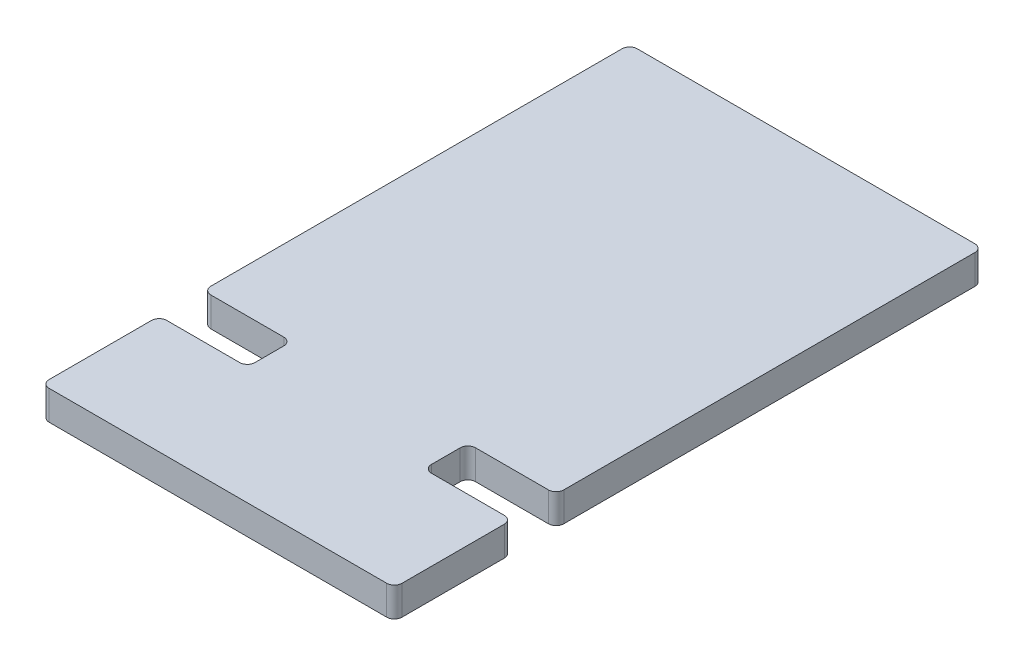
ISO-10303-21;
HEADER;
FILE_DESCRIPTION(('STEP AP214'),'2;1');
FILE_NAME('part.step','',(''),(''),'','','');
FILE_SCHEMA(('AUTOMOTIVE_DESIGN { 1 0 10303 214 1 1 1 1 }'));
ENDSEC;
DATA;
#1=APPLICATION_CONTEXT('core data for automotive mechanical design processes');
#2=APPLICATION_PROTOCOL_DEFINITION('international standard','automotive_design',2000,#1);
#3=PRODUCT_CONTEXT('',#1,'mechanical');
#4=PRODUCT('Part','Part','',(#3));
#5=PRODUCT_RELATED_PRODUCT_CATEGORY('part','',(#4));
#6=PRODUCT_DEFINITION_FORMATION('','',#4);
#7=PRODUCT_DEFINITION_CONTEXT('part definition',#1,'design');
#8=PRODUCT_DEFINITION('design','',#6,#7);
#9=PRODUCT_DEFINITION_SHAPE('','',#8);
#10=(LENGTH_UNIT() NAMED_UNIT(*) SI_UNIT(.MILLI.,.METRE.));
#11=(NAMED_UNIT(*) PLANE_ANGLE_UNIT() SI_UNIT($,.RADIAN.));
#12=(NAMED_UNIT(*) SI_UNIT($,.STERADIAN.) SOLID_ANGLE_UNIT());
#13=UNCERTAINTY_MEASURE_WITH_UNIT(LENGTH_MEASURE(1.E-05),#10,'distance_accuracy_value','');
#14=(GEOMETRIC_REPRESENTATION_CONTEXT(3) GLOBAL_UNCERTAINTY_ASSIGNED_CONTEXT((#13)) GLOBAL_UNIT_ASSIGNED_CONTEXT((#10,
#11,#12)) REPRESENTATION_CONTEXT('',''));
#15=CARTESIAN_POINT('',(0.,0.,0.));
#16=DIRECTION('',(0.,0.,1.));
#17=DIRECTION('',(1.,0.,0.));
#18=AXIS2_PLACEMENT_3D('',#15,#16,#17);
#19=CARTESIAN_POINT('',(-76.2,12.7,127.));
#20=DIRECTION('',(1.,0.,0.));
#21=DIRECTION('',(0.,0.,-1.));
#22=AXIS2_PLACEMENT_3D('',#19,#20,#21);
#23=PLANE('',#22);
#24=DIRECTION('',(0.,0.,1.));
#25=VECTOR('',#24,1.);
#26=CARTESIAN_POINT('',(-76.2,0.,127.));
#27=LINE('',#26,#25);
#28=CARTESIAN_POINT('',(-76.2,0.,-123.698));
#29=VERTEX_POINT('',#28);
#30=CARTESIAN_POINT('',(-76.2,0.,53.848));
#31=VERTEX_POINT('',#30);
#32=EDGE_CURVE('E255',#29,#31,#27,.T.);
#33=ORIENTED_EDGE('',*,*,#32,.T.);
#34=DIRECTION('',(0.,1.,0.));
#35=VECTOR('',#34,1.);
#36=CARTESIAN_POINT('',(-76.2,12.7,53.848));
#37=LINE('',#36,#35);
#38=CARTESIAN_POINT('',(-76.2,12.7,53.848));
#39=VERTEX_POINT('',#38);
#40=EDGE_CURVE('E347',#31,#39,#37,.T.);
#41=ORIENTED_EDGE('',*,*,#40,.T.);
#42=DIRECTION('',(0.,0.,1.));
#43=VECTOR('',#42,1.);
#44=CARTESIAN_POINT('',(-76.2,12.7,127.));
#45=LINE('',#44,#43);
#46=CARTESIAN_POINT('',(-76.2,12.7,-123.698));
#47=VERTEX_POINT('',#46);
#48=EDGE_CURVE('E242',#47,#39,#45,.T.);
#49=ORIENTED_EDGE('',*,*,#48,.F.);
#50=DIRECTION('',(0.,-1.,0.));
#51=VECTOR('',#50,1.);
#52=CARTESIAN_POINT('',(-76.2,12.7,-123.698));
#53=LINE('',#52,#51);
#54=EDGE_CURVE('E344',#47,#29,#53,.T.);
#55=ORIENTED_EDGE('',*,*,#54,.T.);
#56=EDGE_LOOP('',(#33,#41,#49,#55));
#57=FACE_BOUND('',#56,.T.);
#58=ADVANCED_FACE('F34',(#57),#23,.F.);
#59=CARTESIAN_POINT('',(-76.2,0.,79.502));
#60=VERTEX_POINT('',#59);
#61=CARTESIAN_POINT('',(-76.2,0.,123.698));
#62=VERTEX_POINT('',#61);
#63=EDGE_CURVE('E252',#60,#62,#27,.T.);
#64=ORIENTED_EDGE('',*,*,#63,.T.);
#65=DIRECTION('',(0.,-1.,0.));
#66=VECTOR('',#65,1.);
#67=CARTESIAN_POINT('',(-76.2,12.7,123.698));
#68=LINE('',#67,#66);
#69=CARTESIAN_POINT('',(-76.2,12.7,123.698));
#70=VERTEX_POINT('',#69);
#71=EDGE_CURVE('E332',#62,#70,#68,.F.);
#72=ORIENTED_EDGE('',*,*,#71,.T.);
#73=CARTESIAN_POINT('',(-76.2,12.7,79.502));
#74=VERTEX_POINT('',#73);
#75=EDGE_CURVE('E241',#74,#70,#45,.T.);
#76=ORIENTED_EDGE('',*,*,#75,.F.);
#77=DIRECTION('',(0.,1.,0.));
#78=VECTOR('',#77,1.);
#79=CARTESIAN_POINT('',(-76.2,0.,79.502));
#80=LINE('',#79,#78);
#81=EDGE_CURVE('E330',#74,#60,#80,.F.);
#82=ORIENTED_EDGE('',*,*,#81,.T.);
#83=EDGE_LOOP('',(#64,#72,#76,#82));
#84=FACE_BOUND('',#83,.T.);
#85=ADVANCED_FACE('F426',(#84),#23,.F.);
#86=CARTESIAN_POINT('',(0.,12.7,0.));
#87=DIRECTION('',(0.,-1.,0.));
#88=DIRECTION('',(0.,0.,-1.));
#89=AXIS2_PLACEMENT_3D('',#86,#87,#88);
#90=PLANE('',#89);
#91=DIRECTION('',(1.,0.,0.));
#92=VECTOR('',#91,1.);
#93=CARTESIAN_POINT('',(-76.2,12.7,127.));
#94=LINE('',#93,#92);
#95=CARTESIAN_POINT('',(-72.898,12.7,127.));
#96=VERTEX_POINT('',#95);
#97=CARTESIAN_POINT('',(72.8979999999999,12.7,127.));
#98=VERTEX_POINT('',#97);
#99=EDGE_CURVE('E219',#96,#98,#94,.T.);
#100=ORIENTED_EDGE('',*,*,#99,.T.);
#101=CARTESIAN_POINT('',(72.898,12.7,123.698));
#102=DIRECTION('',(0.,-1.,0.));
#103=DIRECTION('',(0.,0.,-1.));
#104=AXIS2_PLACEMENT_3D('',#101,#102,#103);
#105=CIRCLE('',#104,3.302);
#106=CARTESIAN_POINT('',(76.2,12.7,123.698));
#107=VERTEX_POINT('',#106);
#108=EDGE_CURVE('E326',#98,#107,#105,.F.);
#109=ORIENTED_EDGE('',*,*,#108,.T.);
#110=DIRECTION('',(0.,0.,-1.));
#111=VECTOR('',#110,1.);
#112=CARTESIAN_POINT('',(76.2,12.7,127.));
#113=LINE('',#112,#111);
#114=CARTESIAN_POINT('',(76.2,12.7,79.502));
#115=VERTEX_POINT('',#114);
#116=EDGE_CURVE('E237',#107,#115,#113,.T.);
#117=ORIENTED_EDGE('',*,*,#116,.T.);
#118=CARTESIAN_POINT('',(72.898,12.7,79.502));
#119=DIRECTION('',(0.,-1.,0.));
#120=DIRECTION('',(0.,0.,-1.));
#121=AXIS2_PLACEMENT_3D('',#118,#119,#120);
#122=CIRCLE('',#121,3.302);
#123=CARTESIAN_POINT('',(72.898,12.7,76.2));
#124=VERTEX_POINT('',#123);
#125=EDGE_CURVE('E224',#115,#124,#122,.F.);
#126=ORIENTED_EDGE('',*,*,#125,.T.);
#127=DIRECTION('',(1.,0.,0.));
#128=VECTOR('',#127,1.);
#129=CARTESIAN_POINT('',(76.2,12.7,76.2));
#130=LINE('',#129,#128);
#131=CARTESIAN_POINT('',(41.402,12.7,76.2));
#132=VERTEX_POINT('',#131);
#133=EDGE_CURVE('E214',#132,#124,#130,.T.);
#134=ORIENTED_EDGE('',*,*,#133,.F.);
#135=CARTESIAN_POINT('',(41.402,12.7,72.898));
#136=DIRECTION('',(0.,-1.,0.));
#137=DIRECTION('',(0.,0.,-1.));
#138=AXIS2_PLACEMENT_3D('',#135,#136,#137);
#139=CIRCLE('',#138,3.302);
#140=CARTESIAN_POINT('',(38.1,12.7,72.898));
#141=VERTEX_POINT('',#140);
#142=EDGE_CURVE('E198',#132,#141,#139,.T.);
#143=ORIENTED_EDGE('',*,*,#142,.T.);
#144=DIRECTION('',(0.,0.,1.));
#145=VECTOR('',#144,1.);
#146=CARTESIAN_POINT('',(38.1,12.7,57.15));
#147=LINE('',#146,#145);
#148=CARTESIAN_POINT('',(38.1,12.7,60.452));
#149=VERTEX_POINT('',#148);
#150=EDGE_CURVE('E226',#149,#141,#147,.T.);
#151=ORIENTED_EDGE('',*,*,#150,.F.);
#152=CARTESIAN_POINT('',(41.402,12.7,60.452));
#153=DIRECTION('',(0.,-1.,0.));
#154=DIRECTION('',(0.,0.,-1.));
#155=AXIS2_PLACEMENT_3D('',#152,#153,#154);
#156=CIRCLE('',#155,3.302);
#157=CARTESIAN_POINT('',(41.402,12.7,57.15));
#158=VERTEX_POINT('',#157);
#159=EDGE_CURVE('E264',#149,#158,#156,.T.);
#160=ORIENTED_EDGE('',*,*,#159,.T.);
#161=DIRECTION('',(-1.,0.,0.));
#162=VECTOR('',#161,1.);
#163=CARTESIAN_POINT('',(76.2,12.7,57.15));
#164=LINE('',#163,#162);
#165=CARTESIAN_POINT('',(72.898,12.7,57.15));
#166=VERTEX_POINT('',#165);
#167=EDGE_CURVE('E230',#166,#158,#164,.T.);
#168=ORIENTED_EDGE('',*,*,#167,.F.);
#169=CARTESIAN_POINT('',(72.898,12.7,53.848));
#170=DIRECTION('',(0.,-1.,0.));
#171=DIRECTION('',(0.,0.,-1.));
#172=AXIS2_PLACEMENT_3D('',#169,#170,#171);
#173=CIRCLE('',#172,3.302);
#174=CARTESIAN_POINT('',(76.2,12.7,53.848));
#175=VERTEX_POINT('',#174);
#176=EDGE_CURVE('E319',#166,#175,#173,.F.);
#177=ORIENTED_EDGE('',*,*,#176,.T.);
#178=CARTESIAN_POINT('',(76.2,12.7,-123.698));
#179=VERTEX_POINT('',#178);
#180=EDGE_CURVE('E234',#175,#179,#113,.T.);
#181=ORIENTED_EDGE('',*,*,#180,.T.);
#182=CARTESIAN_POINT('',(72.898,12.7,-123.698));
#183=DIRECTION('',(0.,-1.,0.));
#184=DIRECTION('',(0.,0.,-1.));
#185=AXIS2_PLACEMENT_3D('',#182,#183,#184);
#186=CIRCLE('',#185,3.302);
#187=CARTESIAN_POINT('',(72.8979999999999,12.7,-127.));
#188=VERTEX_POINT('',#187);
#189=EDGE_CURVE('E316',#179,#188,#186,.F.);
#190=ORIENTED_EDGE('',*,*,#189,.T.);
#191=DIRECTION('',(-1.,0.,0.));
#192=VECTOR('',#191,1.);
#193=CARTESIAN_POINT('',(-76.2,12.7,-127.));
#194=LINE('',#193,#192);
#195=CARTESIAN_POINT('',(-72.898,12.7,-127.));
#196=VERTEX_POINT('',#195);
#197=EDGE_CURVE('E239',#188,#196,#194,.T.);
#198=ORIENTED_EDGE('',*,*,#197,.T.);
#199=CARTESIAN_POINT('',(-72.898,12.7,-123.698));
#200=DIRECTION('',(0.,-1.,0.));
#201=DIRECTION('',(0.,0.,-1.));
#202=AXIS2_PLACEMENT_3D('',#199,#200,#201);
#203=CIRCLE('',#202,3.302);
#204=EDGE_CURVE('E57',#196,#47,#203,.F.);
#205=ORIENTED_EDGE('',*,*,#204,.T.);
#206=ORIENTED_EDGE('',*,*,#48,.T.);
#207=CARTESIAN_POINT('',(-72.898,12.7,53.848));
#208=DIRECTION('',(0.,-1.,0.));
#209=DIRECTION('',(0.,0.,-1.));
#210=AXIS2_PLACEMENT_3D('',#207,#208,#209);
#211=CIRCLE('',#210,3.302);
#212=CARTESIAN_POINT('',(-72.898,12.7,57.15));
#213=VERTEX_POINT('',#212);
#214=EDGE_CURVE('E49',#39,#213,#211,.F.);
#215=ORIENTED_EDGE('',*,*,#214,.T.);
#216=DIRECTION('',(1.,0.,0.));
#217=VECTOR('',#216,1.);
#218=CARTESIAN_POINT('',(-76.2,12.7,57.15));
#219=LINE('',#218,#217);
#220=CARTESIAN_POINT('',(-41.402,12.7,57.15));
#221=VERTEX_POINT('',#220);
#222=EDGE_CURVE('E370',#213,#221,#219,.T.);
#223=ORIENTED_EDGE('',*,*,#222,.T.);
#224=CARTESIAN_POINT('',(-41.402,12.7,60.452));
#225=DIRECTION('',(0.,-1.,0.));
#226=DIRECTION('',(0.,0.,-1.));
#227=AXIS2_PLACEMENT_3D('',#224,#225,#226);
#228=CIRCLE('',#227,3.302);
#229=CARTESIAN_POINT('',(-38.1,12.7,60.452));
#230=VERTEX_POINT('',#229);
#231=EDGE_CURVE('E283',#221,#230,#228,.T.);
#232=ORIENTED_EDGE('',*,*,#231,.T.);
#233=DIRECTION('',(0.,0.,1.));
#234=VECTOR('',#233,1.);
#235=CARTESIAN_POINT('',(-38.1,12.7,57.15));
#236=LINE('',#235,#234);
#237=CARTESIAN_POINT('',(-38.1,12.7,72.898));
#238=VERTEX_POINT('',#237);
#239=EDGE_CURVE('E376',#230,#238,#236,.T.);
#240=ORIENTED_EDGE('',*,*,#239,.T.);
#241=CARTESIAN_POINT('',(-41.402,12.7,72.898));
#242=DIRECTION('',(0.,-1.,0.));
#243=DIRECTION('',(0.,0.,-1.));
#244=AXIS2_PLACEMENT_3D('',#241,#242,#243);
#245=CIRCLE('',#244,3.302);
#246=CARTESIAN_POINT('',(-41.402,12.7,76.2));
#247=VERTEX_POINT('',#246);
#248=EDGE_CURVE('E279',#238,#247,#245,.T.);
#249=ORIENTED_EDGE('',*,*,#248,.T.);
#250=DIRECTION('',(-1.,0.,0.));
#251=VECTOR('',#250,1.);
#252=CARTESIAN_POINT('',(-76.2,12.7,76.2));
#253=LINE('',#252,#251);
#254=CARTESIAN_POINT('',(-72.898,12.7,76.2));
#255=VERTEX_POINT('',#254);
#256=EDGE_CURVE('E382',#247,#255,#253,.T.);
#257=ORIENTED_EDGE('',*,*,#256,.T.);
#258=CARTESIAN_POINT('',(-72.898,12.7,79.502));
#259=DIRECTION('',(0.,-1.,0.));
#260=DIRECTION('',(0.,0.,-1.));
#261=AXIS2_PLACEMENT_3D('',#258,#259,#260);
#262=CIRCLE('',#261,3.302);
#263=EDGE_CURVE('E321',#255,#74,#262,.F.);
#264=ORIENTED_EDGE('',*,*,#263,.T.);
#265=ORIENTED_EDGE('',*,*,#75,.T.);
#266=CARTESIAN_POINT('',(-72.898,12.7,123.698));
#267=DIRECTION('',(0.,-1.,0.));
#268=DIRECTION('',(0.,0.,-1.));
#269=AXIS2_PLACEMENT_3D('',#266,#267,#268);
#270=CIRCLE('',#269,3.302);
#271=EDGE_CURVE('E323',#70,#96,#270,.F.);
#272=ORIENTED_EDGE('',*,*,#271,.T.);
#273=EDGE_LOOP('',(#100,#109,#117,#126,#134,#143,#151,#160,#168,#177,#181,#190,#198,#205,#206,
#215,#223,#232,#240,#249,#257,#264,#265,#272));
#274=FACE_BOUND('',#273,.T.);
#275=ADVANCED_FACE('F222',(#274),#90,.F.);
#276=CARTESIAN_POINT('',(0.,0.,0.));
#277=DIRECTION('',(0.,-1.,0.));
#278=DIRECTION('',(0.,0.,-1.));
#279=AXIS2_PLACEMENT_3D('',#276,#277,#278);
#280=PLANE('',#279);
#281=DIRECTION('',(0.,0.,-1.));
#282=VECTOR('',#281,1.);
#283=CARTESIAN_POINT('',(76.2,0.,127.));
#284=LINE('',#283,#282);
#285=CARTESIAN_POINT('',(76.2,0.,123.698));
#286=VERTEX_POINT('',#285);
#287=CARTESIAN_POINT('',(76.2,0.,79.502));
#288=VERTEX_POINT('',#287);
#289=EDGE_CURVE('E248',#286,#288,#284,.T.);
#290=ORIENTED_EDGE('',*,*,#289,.F.);
#291=CARTESIAN_POINT('',(72.898,0.,123.698));
#292=DIRECTION('',(0.,-1.,0.));
#293=DIRECTION('',(0.,0.,-1.));
#294=AXIS2_PLACEMENT_3D('',#291,#292,#293);
#295=CIRCLE('',#294,3.302);
#296=CARTESIAN_POINT('',(72.8979999999999,0.,127.));
#297=VERTEX_POINT('',#296);
#298=EDGE_CURVE('E308',#286,#297,#295,.T.);
#299=ORIENTED_EDGE('',*,*,#298,.T.);
#300=DIRECTION('',(1.,0.,0.));
#301=VECTOR('',#300,1.);
#302=CARTESIAN_POINT('',(-76.2,0.,127.));
#303=LINE('',#302,#301);
#304=CARTESIAN_POINT('',(-72.898,0.,127.));
#305=VERTEX_POINT('',#304);
#306=EDGE_CURVE('E238',#305,#297,#303,.T.);
#307=ORIENTED_EDGE('',*,*,#306,.F.);
#308=CARTESIAN_POINT('',(-72.898,0.,123.698));
#309=DIRECTION('',(0.,-1.,0.));
#310=DIRECTION('',(0.,0.,-1.));
#311=AXIS2_PLACEMENT_3D('',#308,#309,#310);
#312=CIRCLE('',#311,3.302);
#313=EDGE_CURVE('E304',#305,#62,#312,.T.);
#314=ORIENTED_EDGE('',*,*,#313,.T.);
#315=ORIENTED_EDGE('',*,*,#63,.F.);
#316=CARTESIAN_POINT('',(-72.898,0.,79.502));
#317=DIRECTION('',(0.,-1.,0.));
#318=DIRECTION('',(0.,0.,-1.));
#319=AXIS2_PLACEMENT_3D('',#316,#317,#318);
#320=CIRCLE('',#319,3.302);
#321=CARTESIAN_POINT('',(-72.898,0.,76.2));
#322=VERTEX_POINT('',#321);
#323=EDGE_CURVE('E302',#60,#322,#320,.T.);
#324=ORIENTED_EDGE('',*,*,#323,.T.);
#325=DIRECTION('',(-1.,0.,0.));
#326=VECTOR('',#325,1.);
#327=CARTESIAN_POINT('',(-76.2,0.,76.2));
#328=LINE('',#327,#326);
#329=CARTESIAN_POINT('',(-41.402,0.,76.2));
#330=VERTEX_POINT('',#329);
#331=EDGE_CURVE('E375',#330,#322,#328,.T.);
#332=ORIENTED_EDGE('',*,*,#331,.F.);
#333=CARTESIAN_POINT('',(-41.402,0.,72.898));
#334=DIRECTION('',(0.,-1.,0.));
#335=DIRECTION('',(0.,0.,-1.));
#336=AXIS2_PLACEMENT_3D('',#333,#334,#335);
#337=CIRCLE('',#336,3.302);
#338=CARTESIAN_POINT('',(-38.1,0.,72.898));
#339=VERTEX_POINT('',#338);
#340=EDGE_CURVE('E281',#330,#339,#337,.F.);
#341=ORIENTED_EDGE('',*,*,#340,.T.);
#342=DIRECTION('',(0.,0.,1.));
#343=VECTOR('',#342,1.);
#344=CARTESIAN_POINT('',(-38.1,0.,57.15));
#345=LINE('',#344,#343);
#346=CARTESIAN_POINT('',(-38.1,0.,60.452));
#347=VERTEX_POINT('',#346);
#348=EDGE_CURVE('E379',#347,#339,#345,.T.);
#349=ORIENTED_EDGE('',*,*,#348,.F.);
#350=CARTESIAN_POINT('',(-41.402,0.,60.452));
#351=DIRECTION('',(0.,-1.,0.));
#352=DIRECTION('',(0.,0.,-1.));
#353=AXIS2_PLACEMENT_3D('',#350,#351,#352);
#354=CIRCLE('',#353,3.302);
#355=CARTESIAN_POINT('',(-41.402,0.,57.15));
#356=VERTEX_POINT('',#355);
#357=EDGE_CURVE('E285',#347,#356,#354,.F.);
#358=ORIENTED_EDGE('',*,*,#357,.T.);
#359=DIRECTION('',(1.,0.,0.));
#360=VECTOR('',#359,1.);
#361=CARTESIAN_POINT('',(-76.2,0.,57.15));
#362=LINE('',#361,#360);
#363=CARTESIAN_POINT('',(-72.898,0.,57.15));
#364=VERTEX_POINT('',#363);
#365=EDGE_CURVE('E367',#364,#356,#362,.T.);
#366=ORIENTED_EDGE('',*,*,#365,.F.);
#367=CARTESIAN_POINT('',(-72.898,0.,53.848));
#368=DIRECTION('',(0.,-1.,0.));
#369=DIRECTION('',(0.,0.,-1.));
#370=AXIS2_PLACEMENT_3D('',#367,#368,#369);
#371=CIRCLE('',#370,3.302);
#372=EDGE_CURVE('E298',#364,#31,#371,.T.);
#373=ORIENTED_EDGE('',*,*,#372,.T.);
#374=ORIENTED_EDGE('',*,*,#32,.F.);
#375=CARTESIAN_POINT('',(-72.898,0.,-123.698));
#376=DIRECTION('',(0.,-1.,0.));
#377=DIRECTION('',(0.,0.,-1.));
#378=AXIS2_PLACEMENT_3D('',#375,#376,#377);
#379=CIRCLE('',#378,3.302);
#380=CARTESIAN_POINT('',(-72.898,0.,-127.));
#381=VERTEX_POINT('',#380);
#382=EDGE_CURVE('E294',#29,#381,#379,.T.);
#383=ORIENTED_EDGE('',*,*,#382,.T.);
#384=DIRECTION('',(-1.,0.,0.));
#385=VECTOR('',#384,1.);
#386=CARTESIAN_POINT('',(-76.2,0.,-127.));
#387=LINE('',#386,#385);
#388=CARTESIAN_POINT('',(72.8979999999999,0.,-127.));
#389=VERTEX_POINT('',#388);
#390=EDGE_CURVE('E249',#389,#381,#387,.T.);
#391=ORIENTED_EDGE('',*,*,#390,.F.);
#392=CARTESIAN_POINT('',(72.898,0.,-123.698));
#393=DIRECTION('',(0.,-1.,0.));
#394=DIRECTION('',(0.,0.,-1.));
#395=AXIS2_PLACEMENT_3D('',#392,#393,#394);
#396=CIRCLE('',#395,3.302);
#397=CARTESIAN_POINT('',(76.2,0.,-123.698));
#398=VERTEX_POINT('',#397);
#399=EDGE_CURVE('E296',#389,#398,#396,.T.);
#400=ORIENTED_EDGE('',*,*,#399,.T.);
#401=CARTESIAN_POINT('',(76.2,0.,53.848));
#402=VERTEX_POINT('',#401);
#403=EDGE_CURVE('E245',#402,#398,#284,.T.);
#404=ORIENTED_EDGE('',*,*,#403,.F.);
#405=CARTESIAN_POINT('',(72.898,0.,53.848));
#406=DIRECTION('',(0.,-1.,0.));
#407=DIRECTION('',(0.,0.,-1.));
#408=AXIS2_PLACEMENT_3D('',#405,#406,#407);
#409=CIRCLE('',#408,3.302);
#410=CARTESIAN_POINT('',(72.898,0.,57.15));
#411=VERTEX_POINT('',#410);
#412=EDGE_CURVE('E300',#402,#411,#409,.T.);
#413=ORIENTED_EDGE('',*,*,#412,.T.);
#414=DIRECTION('',(-1.,0.,0.));
#415=VECTOR('',#414,1.);
#416=CARTESIAN_POINT('',(76.2,0.,57.15));
#417=LINE('',#416,#415);
#418=CARTESIAN_POINT('',(41.402,0.,57.15));
#419=VERTEX_POINT('',#418);
#420=EDGE_CURVE('E225',#411,#419,#417,.T.);
#421=ORIENTED_EDGE('',*,*,#420,.T.);
#422=CARTESIAN_POINT('',(41.402,0.,60.452));
#423=DIRECTION('',(0.,-1.,0.));
#424=DIRECTION('',(0.,0.,-1.));
#425=AXIS2_PLACEMENT_3D('',#422,#423,#424);
#426=CIRCLE('',#425,3.302);
#427=CARTESIAN_POINT('',(38.1,0.,60.452));
#428=VERTEX_POINT('',#427);
#429=EDGE_CURVE('E267',#419,#428,#426,.F.);
#430=ORIENTED_EDGE('',*,*,#429,.T.);
#431=DIRECTION('',(0.,0.,1.));
#432=VECTOR('',#431,1.);
#433=CARTESIAN_POINT('',(38.1,0.,57.15));
#434=LINE('',#433,#432);
#435=CARTESIAN_POINT('',(38.1,0.,72.898));
#436=VERTEX_POINT('',#435);
#437=EDGE_CURVE('E228',#428,#436,#434,.T.);
#438=ORIENTED_EDGE('',*,*,#437,.T.);
#439=CARTESIAN_POINT('',(41.402,0.,72.898));
#440=DIRECTION('',(0.,-1.,0.));
#441=DIRECTION('',(0.,0.,-1.));
#442=AXIS2_PLACEMENT_3D('',#439,#440,#441);
#443=CIRCLE('',#442,3.302);
#444=CARTESIAN_POINT('',(41.402,0.,76.2));
#445=VERTEX_POINT('',#444);
#446=EDGE_CURVE('E207',#436,#445,#443,.F.);
#447=ORIENTED_EDGE('',*,*,#446,.T.);
#448=DIRECTION('',(1.,0.,0.));
#449=VECTOR('',#448,1.);
#450=CARTESIAN_POINT('',(76.2,0.,76.2));
#451=LINE('',#450,#449);
#452=CARTESIAN_POINT('',(72.898,0.,76.2));
#453=VERTEX_POINT('',#452);
#454=EDGE_CURVE('E217',#445,#453,#451,.T.);
#455=ORIENTED_EDGE('',*,*,#454,.T.);
#456=CARTESIAN_POINT('',(72.898,0.,79.502));
#457=DIRECTION('',(0.,-1.,0.));
#458=DIRECTION('',(0.,0.,-1.));
#459=AXIS2_PLACEMENT_3D('',#456,#457,#458);
#460=CIRCLE('',#459,3.302);
#461=EDGE_CURVE('E306',#453,#288,#460,.T.);
#462=ORIENTED_EDGE('',*,*,#461,.T.);
#463=EDGE_LOOP('',(#290,#299,#307,#314,#315,#324,#332,#341,#349,#358,#366,#373,#374,#383,#391,
#400,#404,#413,#421,#430,#438,#447,#455,#462));
#464=FACE_BOUND('',#463,.T.);
#465=ADVANCED_FACE('F364',(#464),#280,.T.);
#466=CARTESIAN_POINT('',(76.2,12.7,127.));
#467=DIRECTION('',(-1.,0.,0.));
#468=DIRECTION('',(0.,0.,1.));
#469=AXIS2_PLACEMENT_3D('',#466,#467,#468);
#470=PLANE('',#469);
#471=ORIENTED_EDGE('',*,*,#116,.F.);
#472=DIRECTION('',(0.,-1.,0.));
#473=VECTOR('',#472,1.);
#474=CARTESIAN_POINT('',(76.2,12.7,123.698));
#475=LINE('',#474,#473);
#476=EDGE_CURVE('E291',#107,#286,#475,.T.);
#477=ORIENTED_EDGE('',*,*,#476,.T.);
#478=ORIENTED_EDGE('',*,*,#289,.T.);
#479=DIRECTION('',(0.,1.,0.));
#480=VECTOR('',#479,1.);
#481=CARTESIAN_POINT('',(76.2,12.7,79.502));
#482=LINE('',#481,#480);
#483=EDGE_CURVE('E288',#288,#115,#482,.T.);
#484=ORIENTED_EDGE('',*,*,#483,.T.);
#485=EDGE_LOOP('',(#471,#477,#478,#484));
#486=FACE_BOUND('',#485,.T.);
#487=ADVANCED_FACE('F441',(#486),#470,.F.);
#488=ORIENTED_EDGE('',*,*,#180,.F.);
#489=DIRECTION('',(0.,1.,0.));
#490=VECTOR('',#489,1.);
#491=CARTESIAN_POINT('',(76.2,12.7,53.848));
#492=LINE('',#491,#490);
#493=EDGE_CURVE('E342',#175,#402,#492,.F.);
#494=ORIENTED_EDGE('',*,*,#493,.T.);
#495=ORIENTED_EDGE('',*,*,#403,.T.);
#496=DIRECTION('',(0.,-1.,0.));
#497=VECTOR('',#496,1.);
#498=CARTESIAN_POINT('',(76.2,12.7,-123.698));
#499=LINE('',#498,#497);
#500=EDGE_CURVE('E340',#398,#179,#499,.F.);
#501=ORIENTED_EDGE('',*,*,#500,.T.);
#502=EDGE_LOOP('',(#488,#494,#495,#501));
#503=FACE_BOUND('',#502,.T.);
#504=ADVANCED_FACE('F438',(#503),#470,.F.);
#505=CARTESIAN_POINT('',(-76.2,12.7,-127.));
#506=DIRECTION('',(0.,0.,1.));
#507=DIRECTION('',(1.,0.,0.));
#508=AXIS2_PLACEMENT_3D('',#505,#506,#507);
#509=PLANE('',#508);
#510=ORIENTED_EDGE('',*,*,#197,.F.);
#511=DIRECTION('',(0.,-1.,0.));
#512=VECTOR('',#511,1.);
#513=CARTESIAN_POINT('',(72.898,12.7,-127.));
#514=LINE('',#513,#512);
#515=EDGE_CURVE('E11',#188,#389,#514,.T.);
#516=ORIENTED_EDGE('',*,*,#515,.T.);
#517=ORIENTED_EDGE('',*,*,#390,.T.);
#518=DIRECTION('',(0.,-1.,0.));
#519=VECTOR('',#518,1.);
#520=CARTESIAN_POINT('',(-72.898,12.7,-127.));
#521=LINE('',#520,#519);
#522=EDGE_CURVE('E42',#381,#196,#521,.F.);
#523=ORIENTED_EDGE('',*,*,#522,.T.);
#524=EDGE_LOOP('',(#510,#516,#517,#523));
#525=FACE_BOUND('',#524,.T.);
#526=ADVANCED_FACE('F353',(#525),#509,.F.);
#527=CARTESIAN_POINT('',(-76.2,12.7,127.));
#528=DIRECTION('',(0.,0.,-1.));
#529=DIRECTION('',(-1.,0.,0.));
#530=AXIS2_PLACEMENT_3D('',#527,#528,#529);
#531=PLANE('',#530);
#532=ORIENTED_EDGE('',*,*,#306,.T.);
#533=DIRECTION('',(0.,-1.,0.));
#534=VECTOR('',#533,1.);
#535=CARTESIAN_POINT('',(72.898,12.7,127.));
#536=LINE('',#535,#534);
#537=EDGE_CURVE('E313',#297,#98,#536,.F.);
#538=ORIENTED_EDGE('',*,*,#537,.T.);
#539=ORIENTED_EDGE('',*,*,#99,.F.);
#540=DIRECTION('',(0.,-1.,0.));
#541=VECTOR('',#540,1.);
#542=CARTESIAN_POINT('',(-72.898,12.7,127.));
#543=LINE('',#542,#541);
#544=EDGE_CURVE('E310',#96,#305,#543,.T.);
#545=ORIENTED_EDGE('',*,*,#544,.T.);
#546=EDGE_LOOP('',(#532,#538,#539,#545));
#547=FACE_BOUND('',#546,.T.);
#548=ADVANCED_FACE('F434',(#547),#531,.F.);
#549=CARTESIAN_POINT('',(76.2,0.,76.2));
#550=DIRECTION('',(0.,0.,1.));
#551=DIRECTION('',(1.,0.,0.));
#552=AXIS2_PLACEMENT_3D('',#549,#550,#551);
#553=PLANE('',#552);
#554=ORIENTED_EDGE('',*,*,#133,.T.);
#555=DIRECTION('',(0.,1.,0.));
#556=VECTOR('',#555,1.);
#557=CARTESIAN_POINT('',(72.898,0.,76.2));
#558=LINE('',#557,#556);
#559=EDGE_CURVE('E328',#124,#453,#558,.F.);
#560=ORIENTED_EDGE('',*,*,#559,.T.);
#561=ORIENTED_EDGE('',*,*,#454,.F.);
#562=DIRECTION('',(0.,1.,0.));
#563=VECTOR('',#562,1.);
#564=CARTESIAN_POINT('',(41.402,12.7,76.2));
#565=LINE('',#564,#563);
#566=EDGE_CURVE('E202',#445,#132,#565,.T.);
#567=ORIENTED_EDGE('',*,*,#566,.T.);
#568=EDGE_LOOP('',(#554,#560,#561,#567));
#569=FACE_BOUND('',#568,.T.);
#570=ADVANCED_FACE('F213',(#569),#553,.F.);
#571=CARTESIAN_POINT('',(38.1,0.,57.15));
#572=DIRECTION('',(-1.,0.,0.));
#573=DIRECTION('',(0.,0.,1.));
#574=AXIS2_PLACEMENT_3D('',#571,#572,#573);
#575=PLANE('',#574);
#576=ORIENTED_EDGE('',*,*,#150,.T.);
#577=DIRECTION('',(0.,1.,0.));
#578=VECTOR('',#577,1.);
#579=CARTESIAN_POINT('',(38.1,0.,72.898));
#580=LINE('',#579,#578);
#581=EDGE_CURVE('E203',#141,#436,#580,.F.);
#582=ORIENTED_EDGE('',*,*,#581,.T.);
#583=ORIENTED_EDGE('',*,*,#437,.F.);
#584=DIRECTION('',(0.,1.,0.));
#585=VECTOR('',#584,1.);
#586=CARTESIAN_POINT('',(38.1,12.7,60.452));
#587=LINE('',#586,#585);
#588=EDGE_CURVE('E218',#428,#149,#587,.T.);
#589=ORIENTED_EDGE('',*,*,#588,.T.);
#590=EDGE_LOOP('',(#576,#582,#583,#589));
#591=FACE_BOUND('',#590,.T.);
#592=ADVANCED_FACE('F459',(#591),#575,.F.);
#593=CARTESIAN_POINT('',(76.2,0.,57.15));
#594=DIRECTION('',(0.,0.,-1.));
#595=DIRECTION('',(-1.,0.,0.));
#596=AXIS2_PLACEMENT_3D('',#593,#594,#595);
#597=PLANE('',#596);
#598=ORIENTED_EDGE('',*,*,#420,.F.);
#599=DIRECTION('',(0.,1.,0.));
#600=VECTOR('',#599,1.);
#601=CARTESIAN_POINT('',(72.898,0.,57.15));
#602=LINE('',#601,#600);
#603=EDGE_CURVE('E337',#411,#166,#602,.T.);
#604=ORIENTED_EDGE('',*,*,#603,.T.);
#605=ORIENTED_EDGE('',*,*,#167,.T.);
#606=DIRECTION('',(0.,1.,0.));
#607=VECTOR('',#606,1.);
#608=CARTESIAN_POINT('',(41.402,0.,57.15));
#609=LINE('',#608,#607);
#610=EDGE_CURVE('E208',#158,#419,#609,.F.);
#611=ORIENTED_EDGE('',*,*,#610,.T.);
#612=EDGE_LOOP('',(#598,#604,#605,#611));
#613=FACE_BOUND('',#612,.T.);
#614=ADVANCED_FACE('F446',(#613),#597,.F.);
#615=CARTESIAN_POINT('',(41.402,0.,72.898));
#616=DIRECTION('',(0.,-1.,0.));
#617=DIRECTION('',(0.,0.,-1.));
#618=AXIS2_PLACEMENT_3D('',#615,#616,#617);
#619=CYLINDRICAL_SURFACE('',#618,3.302);
#620=ORIENTED_EDGE('',*,*,#446,.F.);
#621=ORIENTED_EDGE('',*,*,#581,.F.);
#622=ORIENTED_EDGE('',*,*,#142,.F.);
#623=ORIENTED_EDGE('',*,*,#566,.F.);
#624=EDGE_LOOP('',(#620,#621,#622,#623));
#625=FACE_BOUND('',#624,.T.);
#626=ADVANCED_FACE('F201',(#625),#619,.F.);
#627=CARTESIAN_POINT('',(41.402,0.,60.452));
#628=DIRECTION('',(0.,-1.,0.));
#629=DIRECTION('',(0.,0.,-1.));
#630=AXIS2_PLACEMENT_3D('',#627,#628,#629);
#631=CYLINDRICAL_SURFACE('',#630,3.302);
#632=ORIENTED_EDGE('',*,*,#429,.F.);
#633=ORIENTED_EDGE('',*,*,#610,.F.);
#634=ORIENTED_EDGE('',*,*,#159,.F.);
#635=ORIENTED_EDGE('',*,*,#588,.F.);
#636=EDGE_LOOP('',(#632,#633,#634,#635));
#637=FACE_BOUND('',#636,.T.);
#638=ADVANCED_FACE('F445',(#637),#631,.F.);
#639=CARTESIAN_POINT('',(-76.2,0.,57.15));
#640=DIRECTION('',(0.,0.,1.));
#641=DIRECTION('',(1.,0.,0.));
#642=AXIS2_PLACEMENT_3D('',#639,#640,#641);
#643=PLANE('',#642);
#644=ORIENTED_EDGE('',*,*,#222,.F.);
#645=DIRECTION('',(0.,1.,0.));
#646=VECTOR('',#645,1.);
#647=CARTESIAN_POINT('',(-72.898,0.,57.15));
#648=LINE('',#647,#646);
#649=EDGE_CURVE('E349',#213,#364,#648,.F.);
#650=ORIENTED_EDGE('',*,*,#649,.T.);
#651=ORIENTED_EDGE('',*,*,#365,.T.);
#652=DIRECTION('',(0.,1.,0.));
#653=VECTOR('',#652,1.);
#654=CARTESIAN_POINT('',(-41.402,12.7,57.15));
#655=LINE('',#654,#653);
#656=EDGE_CURVE('E276',#356,#221,#655,.T.);
#657=ORIENTED_EDGE('',*,*,#656,.T.);
#658=EDGE_LOOP('',(#644,#650,#651,#657));
#659=FACE_BOUND('',#658,.T.);
#660=ADVANCED_FACE('F373',(#659),#643,.T.);
#661=CARTESIAN_POINT('',(-38.1,0.,57.15));
#662=DIRECTION('',(-1.,0.,0.));
#663=DIRECTION('',(0.,0.,1.));
#664=AXIS2_PLACEMENT_3D('',#661,#662,#663);
#665=PLANE('',#664);
#666=ORIENTED_EDGE('',*,*,#348,.T.);
#667=DIRECTION('',(0.,1.,0.));
#668=VECTOR('',#667,1.);
#669=CARTESIAN_POINT('',(-38.1,12.7,72.898));
#670=LINE('',#669,#668);
#671=EDGE_CURVE('E271',#339,#238,#670,.T.);
#672=ORIENTED_EDGE('',*,*,#671,.T.);
#673=ORIENTED_EDGE('',*,*,#239,.F.);
#674=DIRECTION('',(0.,1.,0.));
#675=VECTOR('',#674,1.);
#676=CARTESIAN_POINT('',(-38.1,0.,60.452));
#677=LINE('',#676,#675);
#678=EDGE_CURVE('E269',#230,#347,#677,.F.);
#679=ORIENTED_EDGE('',*,*,#678,.T.);
#680=EDGE_LOOP('',(#666,#672,#673,#679));
#681=FACE_BOUND('',#680,.T.);
#682=ADVANCED_FACE('F409',(#681),#665,.T.);
#683=CARTESIAN_POINT('',(-76.2,0.,76.2));
#684=DIRECTION('',(0.,0.,-1.));
#685=DIRECTION('',(-1.,0.,0.));
#686=AXIS2_PLACEMENT_3D('',#683,#684,#685);
#687=PLANE('',#686);
#688=ORIENTED_EDGE('',*,*,#331,.T.);
#689=DIRECTION('',(0.,1.,0.));
#690=VECTOR('',#689,1.);
#691=CARTESIAN_POINT('',(-72.898,12.7,76.2));
#692=LINE('',#691,#690);
#693=EDGE_CURVE('E334',#322,#255,#692,.T.);
#694=ORIENTED_EDGE('',*,*,#693,.T.);
#695=ORIENTED_EDGE('',*,*,#256,.F.);
#696=DIRECTION('',(0.,1.,0.));
#697=VECTOR('',#696,1.);
#698=CARTESIAN_POINT('',(-41.402,0.,76.2));
#699=LINE('',#698,#697);
#700=EDGE_CURVE('E274',#247,#330,#699,.F.);
#701=ORIENTED_EDGE('',*,*,#700,.T.);
#702=EDGE_LOOP('',(#688,#694,#695,#701));
#703=FACE_BOUND('',#702,.T.);
#704=ADVANCED_FACE('F399',(#703),#687,.T.);
#705=CARTESIAN_POINT('',(-41.402,0.,72.898));
#706=DIRECTION('',(0.,-1.,0.));
#707=DIRECTION('',(0.,0.,-1.));
#708=AXIS2_PLACEMENT_3D('',#705,#706,#707);
#709=CYLINDRICAL_SURFACE('',#708,3.302);
#710=ORIENTED_EDGE('',*,*,#340,.F.);
#711=ORIENTED_EDGE('',*,*,#700,.F.);
#712=ORIENTED_EDGE('',*,*,#248,.F.);
#713=ORIENTED_EDGE('',*,*,#671,.F.);
#714=EDGE_LOOP('',(#710,#711,#712,#713));
#715=FACE_BOUND('',#714,.T.);
#716=ADVANCED_FACE('F404',(#715),#709,.F.);
#717=CARTESIAN_POINT('',(-41.402,0.,60.452));
#718=DIRECTION('',(0.,-1.,0.));
#719=DIRECTION('',(0.,0.,-1.));
#720=AXIS2_PLACEMENT_3D('',#717,#718,#719);
#721=CYLINDRICAL_SURFACE('',#720,3.302);
#722=ORIENTED_EDGE('',*,*,#357,.F.);
#723=ORIENTED_EDGE('',*,*,#678,.F.);
#724=ORIENTED_EDGE('',*,*,#231,.F.);
#725=ORIENTED_EDGE('',*,*,#656,.F.);
#726=EDGE_LOOP('',(#722,#723,#724,#725));
#727=FACE_BOUND('',#726,.T.);
#728=ADVANCED_FACE('F413',(#727),#721,.F.);
#729=CARTESIAN_POINT('',(72.898,12.7,123.698));
#730=DIRECTION('',(0.,-1.,0.));
#731=DIRECTION('',(0.,0.,-1.));
#732=AXIS2_PLACEMENT_3D('',#729,#730,#731);
#733=CYLINDRICAL_SURFACE('',#732,3.302);
#734=ORIENTED_EDGE('',*,*,#108,.F.);
#735=ORIENTED_EDGE('',*,*,#537,.F.);
#736=ORIENTED_EDGE('',*,*,#298,.F.);
#737=ORIENTED_EDGE('',*,*,#476,.F.);
#738=EDGE_LOOP('',(#734,#735,#736,#737));
#739=FACE_BOUND('',#738,.T.);
#740=ADVANCED_FACE('F415',(#739),#733,.T.);
#741=CARTESIAN_POINT('',(72.898,12.7,79.502));
#742=DIRECTION('',(0.,1.,0.));
#743=DIRECTION('',(0.,0.,1.));
#744=AXIS2_PLACEMENT_3D('',#741,#742,#743);
#745=CYLINDRICAL_SURFACE('',#744,3.302);
#746=ORIENTED_EDGE('',*,*,#461,.F.);
#747=ORIENTED_EDGE('',*,*,#559,.F.);
#748=ORIENTED_EDGE('',*,*,#125,.F.);
#749=ORIENTED_EDGE('',*,*,#483,.F.);
#750=EDGE_LOOP('',(#746,#747,#748,#749));
#751=FACE_BOUND('',#750,.T.);
#752=ADVANCED_FACE('F421',(#751),#745,.T.);
#753=CARTESIAN_POINT('',(-72.898,12.7,123.698));
#754=DIRECTION('',(0.,-1.,0.));
#755=DIRECTION('',(0.,0.,-1.));
#756=AXIS2_PLACEMENT_3D('',#753,#754,#755);
#757=CYLINDRICAL_SURFACE('',#756,3.302);
#758=ORIENTED_EDGE('',*,*,#271,.F.);
#759=ORIENTED_EDGE('',*,*,#71,.F.);
#760=ORIENTED_EDGE('',*,*,#313,.F.);
#761=ORIENTED_EDGE('',*,*,#544,.F.);
#762=EDGE_LOOP('',(#758,#759,#760,#761));
#763=FACE_BOUND('',#762,.T.);
#764=ADVANCED_FACE('F496',(#763),#757,.T.);
#765=CARTESIAN_POINT('',(-72.898,0.,79.502));
#766=DIRECTION('',(0.,-1.,0.));
#767=DIRECTION('',(0.,0.,-1.));
#768=AXIS2_PLACEMENT_3D('',#765,#766,#767);
#769=CYLINDRICAL_SURFACE('',#768,3.302);
#770=ORIENTED_EDGE('',*,*,#323,.F.);
#771=ORIENTED_EDGE('',*,*,#81,.F.);
#772=ORIENTED_EDGE('',*,*,#263,.F.);
#773=ORIENTED_EDGE('',*,*,#693,.F.);
#774=EDGE_LOOP('',(#770,#771,#772,#773));
#775=FACE_BOUND('',#774,.T.);
#776=ADVANCED_FACE('F502',(#775),#769,.T.);
#777=CARTESIAN_POINT('',(72.898,0.,53.848));
#778=DIRECTION('',(0.,1.,0.));
#779=DIRECTION('',(0.,0.,1.));
#780=AXIS2_PLACEMENT_3D('',#777,#778,#779);
#781=CYLINDRICAL_SURFACE('',#780,3.302);
#782=ORIENTED_EDGE('',*,*,#412,.F.);
#783=ORIENTED_EDGE('',*,*,#493,.F.);
#784=ORIENTED_EDGE('',*,*,#176,.F.);
#785=ORIENTED_EDGE('',*,*,#603,.F.);
#786=EDGE_LOOP('',(#782,#783,#784,#785));
#787=FACE_BOUND('',#786,.T.);
#788=ADVANCED_FACE('F467',(#787),#781,.T.);
#789=CARTESIAN_POINT('',(-72.898,12.7,53.848));
#790=DIRECTION('',(0.,-1.,0.));
#791=DIRECTION('',(0.,0.,-1.));
#792=AXIS2_PLACEMENT_3D('',#789,#790,#791);
#793=CYLINDRICAL_SURFACE('',#792,3.302);
#794=ORIENTED_EDGE('',*,*,#372,.F.);
#795=ORIENTED_EDGE('',*,*,#649,.F.);
#796=ORIENTED_EDGE('',*,*,#214,.F.);
#797=ORIENTED_EDGE('',*,*,#40,.F.);
#798=EDGE_LOOP('',(#794,#795,#796,#797));
#799=FACE_BOUND('',#798,.T.);
#800=ADVANCED_FACE('F368',(#799),#793,.T.);
#801=CARTESIAN_POINT('',(72.898,12.7,-123.698));
#802=DIRECTION('',(0.,-1.,0.));
#803=DIRECTION('',(0.,0.,-1.));
#804=AXIS2_PLACEMENT_3D('',#801,#802,#803);
#805=CYLINDRICAL_SURFACE('',#804,3.302);
#806=ORIENTED_EDGE('',*,*,#189,.F.);
#807=ORIENTED_EDGE('',*,*,#500,.F.);
#808=ORIENTED_EDGE('',*,*,#399,.F.);
#809=ORIENTED_EDGE('',*,*,#515,.F.);
#810=EDGE_LOOP('',(#806,#807,#808,#809));
#811=FACE_BOUND('',#810,.T.);
#812=ADVANCED_FACE('F514',(#811),#805,.T.);
#813=CARTESIAN_POINT('',(-72.898,12.7,-123.698));
#814=DIRECTION('',(0.,-1.,0.));
#815=DIRECTION('',(0.,0.,-1.));
#816=AXIS2_PLACEMENT_3D('',#813,#814,#815);
#817=CYLINDRICAL_SURFACE('',#816,3.302);
#818=ORIENTED_EDGE('',*,*,#204,.F.);
#819=ORIENTED_EDGE('',*,*,#522,.F.);
#820=ORIENTED_EDGE('',*,*,#382,.F.);
#821=ORIENTED_EDGE('',*,*,#54,.F.);
#822=EDGE_LOOP('',(#818,#819,#820,#821));
#823=FACE_BOUND('',#822,.T.);
#824=ADVANCED_FACE('F36',(#823),#817,.T.);
#825=CLOSED_SHELL('',(#58,#85,#275,#465,#487,#504,#526,#548,#570,#592,#614,#626,#638,#660,#682,
#704,#716,#728,#740,#752,#764,#776,#788,#800,#812,#824));
#826=MANIFOLD_SOLID_BREP('B2',#825);
#827=ADVANCED_BREP_SHAPE_REPRESENTATION('',(#18,#826),#14);
#828=SHAPE_DEFINITION_REPRESENTATION(#9,#827);
ENDSEC;
END-ISO-10303-21;
